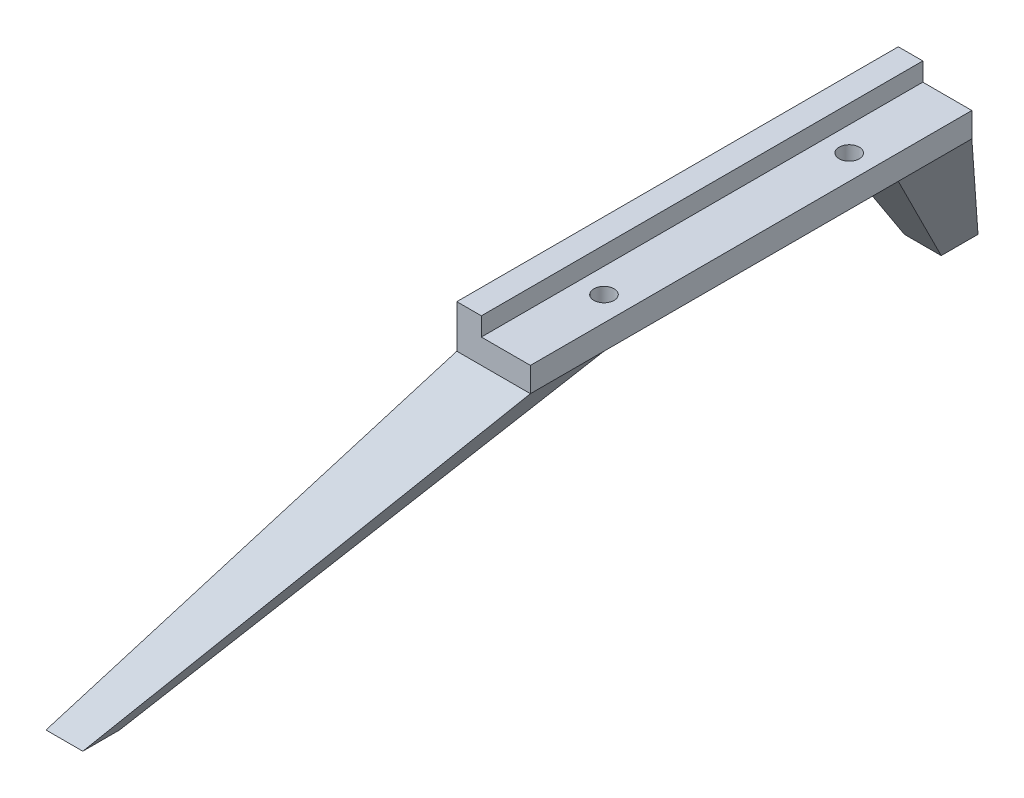
ISO-10303-21;
HEADER;
FILE_DESCRIPTION(('STEP AP214'),'2;1');
FILE_NAME('part.step','',(''),(''),'','','');
FILE_SCHEMA(('AUTOMOTIVE_DESIGN { 1 0 10303 214 1 1 1 1 }'));
ENDSEC;
DATA;
#1=APPLICATION_CONTEXT('core data for automotive mechanical design processes');
#2=APPLICATION_PROTOCOL_DEFINITION('international standard','automotive_design',2000,#1);
#3=PRODUCT_CONTEXT('',#1,'mechanical');
#4=PRODUCT('Part','Part','',(#3));
#5=PRODUCT_RELATED_PRODUCT_CATEGORY('part','',(#4));
#6=PRODUCT_DEFINITION_FORMATION('','',#4);
#7=PRODUCT_DEFINITION_CONTEXT('part definition',#1,'design');
#8=PRODUCT_DEFINITION('design','',#6,#7);
#9=PRODUCT_DEFINITION_SHAPE('','',#8);
#10=(LENGTH_UNIT() NAMED_UNIT(*) SI_UNIT(.MILLI.,.METRE.));
#11=(NAMED_UNIT(*) PLANE_ANGLE_UNIT() SI_UNIT($,.RADIAN.));
#12=(NAMED_UNIT(*) SI_UNIT($,.STERADIAN.) SOLID_ANGLE_UNIT());
#13=UNCERTAINTY_MEASURE_WITH_UNIT(LENGTH_MEASURE(1.E-05),#10,'distance_accuracy_value','');
#14=(GEOMETRIC_REPRESENTATION_CONTEXT(3) GLOBAL_UNCERTAINTY_ASSIGNED_CONTEXT((#13)) GLOBAL_UNIT_ASSIGNED_CONTEXT((#10,
#11,#12)) REPRESENTATION_CONTEXT('',''));
#15=CARTESIAN_POINT('',(0.,0.,0.));
#16=DIRECTION('',(0.,0.,1.));
#17=DIRECTION('',(1.,0.,0.));
#18=AXIS2_PLACEMENT_3D('',#15,#16,#17);
#19=CARTESIAN_POINT('',(8.,0.,36.));
#20=DIRECTION('',(0.,-1.,0.));
#21=DIRECTION('',(0.,0.,-1.));
#22=AXIS2_PLACEMENT_3D('',#19,#20,#21);
#23=PLANE('',#22);
#24=CARTESIAN_POINT('',(4.,0.,-20.));
#25=DIRECTION('',(0.,1.,0.));
#26=DIRECTION('',(0.,0.,1.));
#27=AXIS2_PLACEMENT_3D('',#24,#25,#26);
#28=CIRCLE('',#27,1.65);
#29=CARTESIAN_POINT('',(4.,0.,-18.35));
#30=VERTEX_POINT('',#29);
#31=EDGE_CURVE('E405',#30,#30,#28,.T.);
#32=ORIENTED_EDGE('',*,*,#31,.F.);
#33=EDGE_LOOP('',(#32));
#34=FACE_BOUND('',#33,.T.);
#35=CARTESIAN_POINT('',(4.,0.,20.));
#36=DIRECTION('',(0.,1.,0.));
#37=DIRECTION('',(0.,0.,-1.));
#38=AXIS2_PLACEMENT_3D('',#35,#36,#37);
#39=CIRCLE('',#38,1.65);
#40=CARTESIAN_POINT('',(4.,0.,18.35));
#41=VERTEX_POINT('',#40);
#42=EDGE_CURVE('E409',#41,#41,#39,.T.);
#43=ORIENTED_EDGE('',*,*,#42,.F.);
#44=EDGE_LOOP('',(#43));
#45=FACE_BOUND('',#44,.T.);
#46=DIRECTION('',(-1.,0.,0.));
#47=VECTOR('',#46,1.);
#48=CARTESIAN_POINT('',(8.,0.,-36.));
#49=LINE('',#48,#47);
#50=CARTESIAN_POINT('',(8.,0.,-36.));
#51=VERTEX_POINT('',#50);
#52=CARTESIAN_POINT('',(0.,0.,-36.));
#53=VERTEX_POINT('',#52);
#54=EDGE_CURVE('E246',#51,#53,#49,.T.);
#55=ORIENTED_EDGE('',*,*,#54,.T.);
#56=DIRECTION('',(0.,0.,-1.));
#57=VECTOR('',#56,1.);
#58=CARTESIAN_POINT('',(0.,0.,36.));
#59=LINE('',#58,#57);
#60=CARTESIAN_POINT('',(0.,0.,36.));
#61=VERTEX_POINT('',#60);
#62=EDGE_CURVE('E12',#61,#53,#59,.T.);
#63=ORIENTED_EDGE('',*,*,#62,.F.);
#64=DIRECTION('',(-1.,0.,0.));
#65=VECTOR('',#64,1.);
#66=CARTESIAN_POINT('',(8.,0.,36.));
#67=LINE('',#66,#65);
#68=CARTESIAN_POINT('',(8.,0.,36.));
#69=VERTEX_POINT('',#68);
#70=EDGE_CURVE('E265',#69,#61,#67,.T.);
#71=ORIENTED_EDGE('',*,*,#70,.F.);
#72=DIRECTION('',(0.,0.,-1.));
#73=VECTOR('',#72,1.);
#74=CARTESIAN_POINT('',(8.,0.,36.));
#75=LINE('',#74,#73);
#76=EDGE_CURVE('E245',#69,#51,#75,.T.);
#77=ORIENTED_EDGE('',*,*,#76,.T.);
#78=EDGE_LOOP('',(#55,#63,#71,#77));
#79=FACE_BOUND('',#78,.T.);
#80=ADVANCED_FACE('F151',(#34,#45,#79),#23,.F.);
#81=CARTESIAN_POINT('',(0.,0.,36.));
#82=DIRECTION('',(-1.,0.,0.));
#83=DIRECTION('',(0.,0.,1.));
#84=AXIS2_PLACEMENT_3D('',#81,#82,#83);
#85=PLANE('',#84);
#86=DIRECTION('',(0.,1.,0.));
#87=VECTOR('',#86,1.);
#88=CARTESIAN_POINT('',(0.,0.,-36.));
#89=LINE('',#88,#87);
#90=CARTESIAN_POINT('',(0.,3.,-36.));
#91=VERTEX_POINT('',#90);
#92=EDGE_CURVE('E250',#53,#91,#89,.T.);
#93=ORIENTED_EDGE('',*,*,#92,.T.);
#94=DIRECTION('',(0.,0.,-1.));
#95=VECTOR('',#94,1.);
#96=CARTESIAN_POINT('',(0.,3.,36.));
#97=LINE('',#96,#95);
#98=CARTESIAN_POINT('',(0.,3.,36.));
#99=VERTEX_POINT('',#98);
#100=EDGE_CURVE('E159',#99,#91,#97,.T.);
#101=ORIENTED_EDGE('',*,*,#100,.F.);
#102=DIRECTION('',(0.,1.,0.));
#103=VECTOR('',#102,1.);
#104=CARTESIAN_POINT('',(0.,0.,36.));
#105=LINE('',#104,#103);
#106=EDGE_CURVE('E203',#61,#99,#105,.T.);
#107=ORIENTED_EDGE('',*,*,#106,.F.);
#108=ORIENTED_EDGE('',*,*,#62,.T.);
#109=EDGE_LOOP('',(#93,#101,#107,#108));
#110=FACE_BOUND('',#109,.T.);
#111=ADVANCED_FACE('F421',(#110),#85,.F.);
#112=CARTESIAN_POINT('',(0.,3.,36.));
#113=DIRECTION('',(0.,-1.,0.));
#114=DIRECTION('',(1.,0.,0.));
#115=AXIS2_PLACEMENT_3D('',#112,#113,#114);
#116=PLANE('',#115);
#117=DIRECTION('',(-1.,0.,0.));
#118=VECTOR('',#117,1.);
#119=CARTESIAN_POINT('',(0.,3.,-36.));
#120=LINE('',#119,#118);
#121=CARTESIAN_POINT('',(-4.,3.,-36.));
#122=VERTEX_POINT('',#121);
#123=EDGE_CURVE('E226',#91,#122,#120,.T.);
#124=ORIENTED_EDGE('',*,*,#123,.T.);
#125=DIRECTION('',(0.,0.,-1.));
#126=VECTOR('',#125,1.);
#127=CARTESIAN_POINT('',(-4.,3.,36.));
#128=LINE('',#127,#126);
#129=CARTESIAN_POINT('',(-4.,3.,36.));
#130=VERTEX_POINT('',#129);
#131=EDGE_CURVE('E223',#130,#122,#128,.T.);
#132=ORIENTED_EDGE('',*,*,#131,.F.);
#133=DIRECTION('',(-1.,0.,0.));
#134=VECTOR('',#133,1.);
#135=CARTESIAN_POINT('',(0.,3.,36.));
#136=LINE('',#135,#134);
#137=EDGE_CURVE('E211',#99,#130,#136,.T.);
#138=ORIENTED_EDGE('',*,*,#137,.F.);
#139=ORIENTED_EDGE('',*,*,#100,.T.);
#140=EDGE_LOOP('',(#124,#132,#138,#139));
#141=FACE_BOUND('',#140,.T.);
#142=ADVANCED_FACE('F224',(#141),#116,.F.);
#143=CARTESIAN_POINT('',(-4.,3.,36.));
#144=DIRECTION('',(1.,0.,0.));
#145=DIRECTION('',(0.,1.,0.));
#146=AXIS2_PLACEMENT_3D('',#143,#144,#145);
#147=PLANE('',#146);
#148=DIRECTION('',(0.,-1.,0.));
#149=VECTOR('',#148,1.);
#150=CARTESIAN_POINT('',(-4.,3.,-36.));
#151=LINE('',#150,#149);
#152=CARTESIAN_POINT('',(-4.,-4.,-36.));
#153=VERTEX_POINT('',#152);
#154=EDGE_CURVE('E256',#122,#153,#151,.T.);
#155=ORIENTED_EDGE('',*,*,#154,.T.);
#156=DIRECTION('',(0.,0.,1.));
#157=VECTOR('',#156,1.);
#158=CARTESIAN_POINT('',(-4.,-4.,-30.));
#159=LINE('',#158,#157);
#160=CARTESIAN_POINT('',(-4.,-4.,-24.));
#161=VERTEX_POINT('',#160);
#162=EDGE_CURVE('E282',#153,#161,#159,.T.);
#163=ORIENTED_EDGE('',*,*,#162,.T.);
#164=DIRECTION('',(0.,0.,-1.));
#165=VECTOR('',#164,1.);
#166=CARTESIAN_POINT('',(-4.,-4.,36.));
#167=LINE('',#166,#165);
#168=CARTESIAN_POINT('',(-4.,-4.,24.));
#169=VERTEX_POINT('',#168);
#170=EDGE_CURVE('E271',#169,#161,#167,.T.);
#171=ORIENTED_EDGE('',*,*,#170,.F.);
#172=CARTESIAN_POINT('',(-4.,-4.,36.));
#173=VERTEX_POINT('',#172);
#174=EDGE_CURVE('E231',#173,#169,#167,.T.);
#175=ORIENTED_EDGE('',*,*,#174,.F.);
#176=DIRECTION('',(0.,-1.,0.));
#177=VECTOR('',#176,1.);
#178=CARTESIAN_POINT('',(-4.,3.,36.));
#179=LINE('',#178,#177);
#180=EDGE_CURVE('E216',#130,#173,#179,.T.);
#181=ORIENTED_EDGE('',*,*,#180,.F.);
#182=ORIENTED_EDGE('',*,*,#131,.T.);
#183=EDGE_LOOP('',(#155,#163,#171,#175,#181,#182));
#184=FACE_BOUND('',#183,.T.);
#185=ADVANCED_FACE('F233',(#184),#147,.F.);
#186=CARTESIAN_POINT('',(-4.,-4.,36.));
#187=DIRECTION('',(0.,1.,0.));
#188=DIRECTION('',(0.,0.,1.));
#189=AXIS2_PLACEMENT_3D('',#186,#187,#188);
#190=PLANE('',#189);
#191=CARTESIAN_POINT('',(4.,-4.,-20.));
#192=DIRECTION('',(0.,1.,0.));
#193=DIRECTION('',(0.,0.,1.));
#194=AXIS2_PLACEMENT_3D('',#191,#192,#193);
#195=CIRCLE('',#194,1.65);
#196=CARTESIAN_POINT('',(4.,-4.,-18.35));
#197=VERTEX_POINT('',#196);
#198=EDGE_CURVE('E251',#197,#197,#195,.T.);
#199=ORIENTED_EDGE('',*,*,#198,.T.);
#200=EDGE_LOOP('',(#199));
#201=FACE_BOUND('',#200,.T.);
#202=CARTESIAN_POINT('',(4.,-4.,20.));
#203=DIRECTION('',(0.,1.,0.));
#204=DIRECTION('',(0.,0.,-1.));
#205=AXIS2_PLACEMENT_3D('',#202,#203,#204);
#206=CIRCLE('',#205,1.65);
#207=CARTESIAN_POINT('',(4.,-4.,18.35));
#208=VERTEX_POINT('',#207);
#209=EDGE_CURVE('E372',#208,#208,#206,.T.);
#210=ORIENTED_EDGE('',*,*,#209,.T.);
#211=EDGE_LOOP('',(#210));
#212=FACE_BOUND('',#211,.T.);
#213=DIRECTION('',(0.,0.,-1.));
#214=VECTOR('',#213,1.);
#215=CARTESIAN_POINT('',(8.,-4.,36.));
#216=LINE('',#215,#214);
#217=CARTESIAN_POINT('',(8.,-4.,24.));
#218=VERTEX_POINT('',#217);
#219=CARTESIAN_POINT('',(8.,-4.,-24.));
#220=VERTEX_POINT('',#219);
#221=EDGE_CURVE('E166',#218,#220,#216,.T.);
#222=ORIENTED_EDGE('',*,*,#221,.F.);
#223=DIRECTION('',(1.,0.,0.));
#224=VECTOR('',#223,1.);
#225=CARTESIAN_POINT('',(2.,-4.,24.));
#226=LINE('',#225,#224);
#227=EDGE_CURVE('E341',#169,#218,#226,.T.);
#228=ORIENTED_EDGE('',*,*,#227,.F.);
#229=ORIENTED_EDGE('',*,*,#170,.T.);
#230=DIRECTION('',(1.,0.,0.));
#231=VECTOR('',#230,1.);
#232=CARTESIAN_POINT('',(2.,-4.,-24.));
#233=LINE('',#232,#231);
#234=EDGE_CURVE('E351',#161,#220,#233,.T.);
#235=ORIENTED_EDGE('',*,*,#234,.T.);
#236=EDGE_LOOP('',(#222,#228,#229,#235));
#237=FACE_BOUND('',#236,.T.);
#238=ADVANCED_FACE('F432',(#201,#212,#237),#190,.F.);
#239=CARTESIAN_POINT('',(8.,-4.,36.));
#240=DIRECTION('',(-1.,0.,0.));
#241=DIRECTION('',(0.,0.,1.));
#242=AXIS2_PLACEMENT_3D('',#239,#240,#241);
#243=PLANE('',#242);
#244=DIRECTION('',(0.,1.,0.));
#245=VECTOR('',#244,1.);
#246=CARTESIAN_POINT('',(8.,-4.,-36.));
#247=LINE('',#246,#245);
#248=CARTESIAN_POINT('',(8.,-4.,-36.));
#249=VERTEX_POINT('',#248);
#250=EDGE_CURVE('E195',#249,#51,#247,.T.);
#251=ORIENTED_EDGE('',*,*,#250,.T.);
#252=ORIENTED_EDGE('',*,*,#76,.F.);
#253=DIRECTION('',(0.,1.,0.));
#254=VECTOR('',#253,1.);
#255=CARTESIAN_POINT('',(8.,-4.,36.));
#256=LINE('',#255,#254);
#257=CARTESIAN_POINT('',(8.,-4.,36.));
#258=VERTEX_POINT('',#257);
#259=EDGE_CURVE('E175',#258,#69,#256,.T.);
#260=ORIENTED_EDGE('',*,*,#259,.F.);
#261=EDGE_CURVE('E268',#258,#218,#216,.T.);
#262=ORIENTED_EDGE('',*,*,#261,.T.);
#263=ORIENTED_EDGE('',*,*,#221,.T.);
#264=DIRECTION('',(0.,0.,-1.));
#265=VECTOR('',#264,1.);
#266=CARTESIAN_POINT('',(8.,-4.,-30.));
#267=LINE('',#266,#265);
#268=EDGE_CURVE('E347',#220,#249,#267,.T.);
#269=ORIENTED_EDGE('',*,*,#268,.T.);
#270=EDGE_LOOP('',(#251,#252,#260,#262,#263,#269));
#271=FACE_BOUND('',#270,.T.);
#272=ADVANCED_FACE('F435',(#271),#243,.F.);
#273=CARTESIAN_POINT('',(0.,0.,36.));
#274=DIRECTION('',(0.,0.,-1.));
#275=DIRECTION('',(-1.,0.,0.));
#276=AXIS2_PLACEMENT_3D('',#273,#274,#275);
#277=PLANE('',#276);
#278=ORIENTED_EDGE('',*,*,#70,.T.);
#279=ORIENTED_EDGE('',*,*,#106,.T.);
#280=ORIENTED_EDGE('',*,*,#137,.T.);
#281=ORIENTED_EDGE('',*,*,#180,.T.);
#282=DIRECTION('',(1.,0.,0.));
#283=VECTOR('',#282,1.);
#284=CARTESIAN_POINT('',(-4.,-4.,36.));
#285=LINE('',#284,#283);
#286=EDGE_CURVE('E237',#173,#258,#285,.T.);
#287=ORIENTED_EDGE('',*,*,#286,.T.);
#288=ORIENTED_EDGE('',*,*,#259,.T.);
#289=EDGE_LOOP('',(#278,#279,#280,#281,#287,#288));
#290=FACE_BOUND('',#289,.T.);
#291=ADVANCED_FACE('F213',(#290),#277,.F.);
#292=CARTESIAN_POINT('',(0.,0.,-36.));
#293=DIRECTION('',(0.,0.,-1.));
#294=DIRECTION('',(-1.,0.,0.));
#295=AXIS2_PLACEMENT_3D('',#292,#293,#294);
#296=PLANE('',#295);
#297=ORIENTED_EDGE('',*,*,#54,.F.);
#298=ORIENTED_EDGE('',*,*,#250,.F.);
#299=DIRECTION('',(1.,0.,0.));
#300=VECTOR('',#299,1.);
#301=CARTESIAN_POINT('',(-4.,-4.,-36.));
#302=LINE('',#301,#300);
#303=EDGE_CURVE('E259',#153,#249,#302,.T.);
#304=ORIENTED_EDGE('',*,*,#303,.F.);
#305=ORIENTED_EDGE('',*,*,#154,.F.);
#306=ORIENTED_EDGE('',*,*,#123,.F.);
#307=ORIENTED_EDGE('',*,*,#92,.F.);
#308=EDGE_LOOP('',(#297,#298,#304,#305,#306,#307));
#309=FACE_BOUND('',#308,.T.);
#310=ADVANCED_FACE('F276',(#309),#296,.T.);
#311=CARTESIAN_POINT('',(4.,-4.,20.));
#312=DIRECTION('',(0.,1.,0.));
#313=DIRECTION('',(0.,0.,1.));
#314=AXIS2_PLACEMENT_3D('',#311,#312,#313);
#315=CYLINDRICAL_SURFACE('',#314,1.65);
#316=ORIENTED_EDGE('',*,*,#209,.F.);
#317=EDGE_LOOP('',(#316));
#318=FACE_BOUND('',#317,.T.);
#319=ORIENTED_EDGE('',*,*,#42,.T.);
#320=EDGE_LOOP('',(#319));
#321=FACE_BOUND('',#320,.T.);
#322=ADVANCED_FACE('F441',(#318,#321),#315,.F.);
#323=CARTESIAN_POINT('',(4.,-4.,-20.));
#324=DIRECTION('',(0.,1.,0.));
#325=DIRECTION('',(0.,0.,1.));
#326=AXIS2_PLACEMENT_3D('',#323,#324,#325);
#327=CYLINDRICAL_SURFACE('',#326,1.65);
#328=ORIENTED_EDGE('',*,*,#198,.F.);
#329=EDGE_LOOP('',(#328));
#330=FACE_BOUND('',#329,.T.);
#331=ORIENTED_EDGE('',*,*,#31,.T.);
#332=EDGE_LOOP('',(#331));
#333=FACE_BOUND('',#332,.T.);
#334=ADVANCED_FACE('F446',(#330,#333),#327,.F.);
#335=CARTESIAN_POINT('',(-34.,-54.,-73.));
#336=DIRECTION('',(-0.857492925712544,0.514495755427526,0.));
#337=DIRECTION('',(0.,0.,1.));
#338=AXIS2_PLACEMENT_3D('',#335,#336,#337);
#339=PLANE('',#338);
#340=DIRECTION('',(0.,0.,1.));
#341=VECTOR('',#340,1.);
#342=CARTESIAN_POINT('',(-34.,-54.,-70.));
#343=LINE('',#342,#341);
#344=CARTESIAN_POINT('',(-34.,-54.,-73.));
#345=VERTEX_POINT('',#344);
#346=CARTESIAN_POINT('',(-34.,-54.,-67.));
#347=VERTEX_POINT('',#346);
#348=EDGE_CURVE('E368',#345,#347,#343,.T.);
#349=ORIENTED_EDGE('',*,*,#348,.T.);
#350=DIRECTION('',(0.414078773557172,0.690131289261953,0.59351290876528));
#351=VECTOR('',#350,1.);
#352=CARTESIAN_POINT('',(-19.,-29.,-45.5));
#353=LINE('',#352,#351);
#354=EDGE_CURVE('E373',#347,#161,#353,.T.);
#355=ORIENTED_EDGE('',*,*,#354,.T.);
#356=ORIENTED_EDGE('',*,*,#162,.F.);
#357=DIRECTION('',(0.434417781605021,0.724029636008368,0.535781930646193));
#358=VECTOR('',#357,1.);
#359=CARTESIAN_POINT('',(-19.,-29.,-54.5));
#360=LINE('',#359,#358);
#361=EDGE_CURVE('E394',#345,#153,#360,.T.);
#362=ORIENTED_EDGE('',*,*,#361,.F.);
#363=EDGE_LOOP('',(#349,#355,#356,#362));
#364=FACE_BOUND('',#363,.T.);
#365=ADVANCED_FACE('F450',(#364),#339,.T.);
#366=CARTESIAN_POINT('',(-34.,-54.,-67.));
#367=DIRECTION('',(0.,-0.652039268828048,0.758185196311683));
#368=DIRECTION('',(1.,0.,0.));
#369=AXIS2_PLACEMENT_3D('',#366,#367,#368);
#370=PLANE('',#369);
#371=DIRECTION('',(1.,0.,0.));
#372=VECTOR('',#371,1.);
#373=CARTESIAN_POINT('',(-31.,-54.,-67.));
#374=LINE('',#373,#372);
#375=CARTESIAN_POINT('',(-28.,-54.,-67.));
#376=VERTEX_POINT('',#375);
#377=EDGE_CURVE('E376',#347,#376,#374,.T.);
#378=ORIENTED_EDGE('',*,*,#377,.T.);
#379=DIRECTION('',(0.479148935500745,0.665484632639923,0.572316784070334));
#380=VECTOR('',#379,1.);
#381=CARTESIAN_POINT('',(-10.,-29.,-45.5));
#382=LINE('',#381,#380);
#383=EDGE_CURVE('E380',#376,#220,#382,.T.);
#384=ORIENTED_EDGE('',*,*,#383,.T.);
#385=ORIENTED_EDGE('',*,*,#234,.F.);
#386=ORIENTED_EDGE('',*,*,#354,.F.);
#387=EDGE_LOOP('',(#378,#384,#385,#386));
#388=FACE_BOUND('',#387,.T.);
#389=ADVANCED_FACE('F460',(#388),#370,.T.);
#390=CARTESIAN_POINT('',(-28.,-54.,-67.));
#391=DIRECTION('',(0.811534341451494,-0.584304725845076,0.));
#392=DIRECTION('',(0.,0.,-1.));
#393=AXIS2_PLACEMENT_3D('',#390,#391,#392);
#394=PLANE('',#393);
#395=DIRECTION('',(0.,0.,-1.));
#396=VECTOR('',#395,1.);
#397=CARTESIAN_POINT('',(-28.,-54.,-70.));
#398=LINE('',#397,#396);
#399=CARTESIAN_POINT('',(-28.,-54.,-73.));
#400=VERTEX_POINT('',#399);
#401=EDGE_CURVE('E383',#376,#400,#398,.T.);
#402=ORIENTED_EDGE('',*,*,#401,.T.);
#403=DIRECTION('',(0.500918807293641,0.695720565685613,0.514833218607354));
#404=VECTOR('',#403,1.);
#405=CARTESIAN_POINT('',(-10.,-29.,-54.5));
#406=LINE('',#405,#404);
#407=EDGE_CURVE('E387',#400,#249,#406,.T.);
#408=ORIENTED_EDGE('',*,*,#407,.T.);
#409=ORIENTED_EDGE('',*,*,#268,.F.);
#410=ORIENTED_EDGE('',*,*,#383,.F.);
#411=EDGE_LOOP('',(#402,#408,#409,#410));
#412=FACE_BOUND('',#411,.T.);
#413=ADVANCED_FACE('F456',(#412),#394,.T.);
#414=CARTESIAN_POINT('',(-28.,-54.,-73.));
#415=DIRECTION('',(0.,0.594843005410295,-0.803841899203101));
#416=DIRECTION('',(-1.,0.,0.));
#417=AXIS2_PLACEMENT_3D('',#414,#415,#416);
#418=PLANE('',#417);
#419=DIRECTION('',(-1.,0.,0.));
#420=VECTOR('',#419,1.);
#421=CARTESIAN_POINT('',(-31.,-54.,-73.));
#422=LINE('',#421,#420);
#423=EDGE_CURVE('E391',#400,#345,#422,.T.);
#424=ORIENTED_EDGE('',*,*,#423,.T.);
#425=ORIENTED_EDGE('',*,*,#361,.T.);
#426=ORIENTED_EDGE('',*,*,#303,.T.);
#427=ORIENTED_EDGE('',*,*,#407,.F.);
#428=EDGE_LOOP('',(#424,#425,#426,#427));
#429=FACE_BOUND('',#428,.T.);
#430=ADVANCED_FACE('F452',(#429),#418,.T.);
#431=CARTESIAN_POINT('',(0.,-54.,0.));
#432=DIRECTION('',(0.,1.,0.));
#433=DIRECTION('',(0.,0.,1.));
#434=AXIS2_PLACEMENT_3D('',#431,#432,#433);
#435=PLANE('',#434);
#436=ORIENTED_EDGE('',*,*,#423,.F.);
#437=ORIENTED_EDGE('',*,*,#401,.F.);
#438=ORIENTED_EDGE('',*,*,#377,.F.);
#439=ORIENTED_EDGE('',*,*,#348,.F.);
#440=EDGE_LOOP('',(#436,#437,#438,#439));
#441=FACE_BOUND('',#440,.T.);
#442=ADVANCED_FACE('F455',(#441),#435,.F.);
#443=CARTESIAN_POINT('',(-34.,-54.,73.));
#444=DIRECTION('',(-0.857492925712544,0.514495755427526,0.));
#445=DIRECTION('',(0.,0.,-1.));
#446=AXIS2_PLACEMENT_3D('',#443,#444,#445);
#447=PLANE('',#446);
#448=DIRECTION('',(0.,0.,-1.));
#449=VECTOR('',#448,1.);
#450=CARTESIAN_POINT('',(-34.,-54.,70.));
#451=LINE('',#450,#449);
#452=CARTESIAN_POINT('',(-34.,-54.,73.));
#453=VERTEX_POINT('',#452);
#454=CARTESIAN_POINT('',(-34.,-54.,67.));
#455=VERTEX_POINT('',#454);
#456=EDGE_CURVE('E328',#453,#455,#451,.T.);
#457=ORIENTED_EDGE('',*,*,#456,.F.);
#458=DIRECTION('',(0.434417781605021,0.724029636008368,-0.535781930646193));
#459=VECTOR('',#458,1.);
#460=CARTESIAN_POINT('',(-19.,-29.,54.5));
#461=LINE('',#460,#459);
#462=EDGE_CURVE('E335',#453,#173,#461,.T.);
#463=ORIENTED_EDGE('',*,*,#462,.T.);
#464=ORIENTED_EDGE('',*,*,#174,.T.);
#465=DIRECTION('',(0.414078773557172,0.690131289261953,-0.59351290876528));
#466=VECTOR('',#465,1.);
#467=CARTESIAN_POINT('',(-19.,-29.,45.5));
#468=LINE('',#467,#466);
#469=EDGE_CURVE('E345',#455,#169,#468,.T.);
#470=ORIENTED_EDGE('',*,*,#469,.F.);
#471=EDGE_LOOP('',(#457,#463,#464,#470));
#472=FACE_BOUND('',#471,.T.);
#473=ADVANCED_FACE('F344',(#472),#447,.T.);
#474=CARTESIAN_POINT('',(-34.,-54.,67.));
#475=DIRECTION('',(0.,-0.652039268828048,-0.758185196311683));
#476=DIRECTION('',(1.,0.,0.));
#477=AXIS2_PLACEMENT_3D('',#474,#475,#476);
#478=PLANE('',#477);
#479=DIRECTION('',(1.,0.,0.));
#480=VECTOR('',#479,1.);
#481=CARTESIAN_POINT('',(-31.,-54.,67.));
#482=LINE('',#481,#480);
#483=CARTESIAN_POINT('',(-28.,-54.,67.));
#484=VERTEX_POINT('',#483);
#485=EDGE_CURVE('E353',#455,#484,#482,.T.);
#486=ORIENTED_EDGE('',*,*,#485,.F.);
#487=ORIENTED_EDGE('',*,*,#469,.T.);
#488=ORIENTED_EDGE('',*,*,#227,.T.);
#489=DIRECTION('',(0.479148935500745,0.665484632639923,-0.572316784070334));
#490=VECTOR('',#489,1.);
#491=CARTESIAN_POINT('',(-10.,-29.,45.5));
#492=LINE('',#491,#490);
#493=EDGE_CURVE('E358',#484,#218,#492,.T.);
#494=ORIENTED_EDGE('',*,*,#493,.F.);
#495=EDGE_LOOP('',(#486,#487,#488,#494));
#496=FACE_BOUND('',#495,.T.);
#497=ADVANCED_FACE('F475',(#496),#478,.T.);
#498=CARTESIAN_POINT('',(-28.,-54.,67.));
#499=DIRECTION('',(0.811534341451494,-0.584304725845076,0.));
#500=DIRECTION('',(0.,0.,1.));
#501=AXIS2_PLACEMENT_3D('',#498,#499,#500);
#502=PLANE('',#501);
#503=DIRECTION('',(0.,0.,1.));
#504=VECTOR('',#503,1.);
#505=CARTESIAN_POINT('',(-28.,-54.,70.));
#506=LINE('',#505,#504);
#507=CARTESIAN_POINT('',(-28.,-54.,73.));
#508=VERTEX_POINT('',#507);
#509=EDGE_CURVE('E329',#484,#508,#506,.T.);
#510=ORIENTED_EDGE('',*,*,#509,.F.);
#511=ORIENTED_EDGE('',*,*,#493,.T.);
#512=ORIENTED_EDGE('',*,*,#261,.F.);
#513=DIRECTION('',(0.500918807293641,0.695720565685613,-0.514833218607354));
#514=VECTOR('',#513,1.);
#515=CARTESIAN_POINT('',(-10.,-29.,54.5));
#516=LINE('',#515,#514);
#517=EDGE_CURVE('E334',#508,#258,#516,.T.);
#518=ORIENTED_EDGE('',*,*,#517,.F.);
#519=EDGE_LOOP('',(#510,#511,#512,#518));
#520=FACE_BOUND('',#519,.T.);
#521=ADVANCED_FACE('F472',(#520),#502,.T.);
#522=CARTESIAN_POINT('',(-28.,-54.,73.));
#523=DIRECTION('',(0.,0.594843005410295,0.803841899203101));
#524=DIRECTION('',(-1.,0.,0.));
#525=AXIS2_PLACEMENT_3D('',#522,#523,#524);
#526=PLANE('',#525);
#527=DIRECTION('',(-1.,0.,0.));
#528=VECTOR('',#527,1.);
#529=CARTESIAN_POINT('',(-31.,-54.,73.));
#530=LINE('',#529,#528);
#531=EDGE_CURVE('E323',#508,#453,#530,.T.);
#532=ORIENTED_EDGE('',*,*,#531,.F.);
#533=ORIENTED_EDGE('',*,*,#517,.T.);
#534=ORIENTED_EDGE('',*,*,#286,.F.);
#535=ORIENTED_EDGE('',*,*,#462,.F.);
#536=EDGE_LOOP('',(#532,#533,#534,#535));
#537=FACE_BOUND('',#536,.T.);
#538=ADVANCED_FACE('F338',(#537),#526,.T.);
#539=CARTESIAN_POINT('',(0.,-54.,0.));
#540=DIRECTION('',(0.,1.,0.));
#541=DIRECTION('',(0.,0.,-1.));
#542=AXIS2_PLACEMENT_3D('',#539,#540,#541);
#543=PLANE('',#542);
#544=ORIENTED_EDGE('',*,*,#531,.T.);
#545=ORIENTED_EDGE('',*,*,#456,.T.);
#546=ORIENTED_EDGE('',*,*,#485,.T.);
#547=ORIENTED_EDGE('',*,*,#509,.T.);
#548=EDGE_LOOP('',(#544,#545,#546,#547));
#549=FACE_BOUND('',#548,.T.);
#550=ADVANCED_FACE('F325',(#549),#543,.F.);
#551=CLOSED_SHELL('',(#80,#111,#142,#185,#238,#272,#291,#310,#322,#334,#365,#389,#413,#430,#442,
#473,#497,#521,#538,#550));
#552=MANIFOLD_SOLID_BREP('B2',#551);
#553=ADVANCED_BREP_SHAPE_REPRESENTATION('',(#18,#552),#14);
#554=SHAPE_DEFINITION_REPRESENTATION(#9,#553);
ENDSEC;
END-ISO-10303-21;
